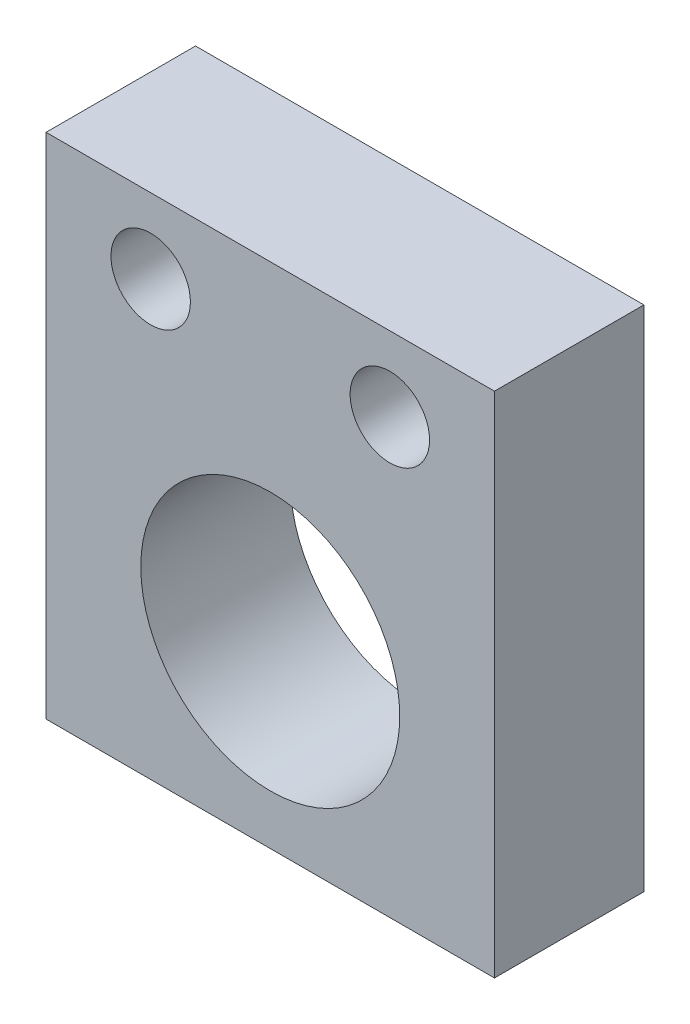
ISO-10303-21;
HEADER;
FILE_DESCRIPTION(('STEP AP214'),'2;1');
FILE_NAME('part.step','',(''),(''),'','','');
FILE_SCHEMA(('AUTOMOTIVE_DESIGN { 1 0 10303 214 1 1 1 1 }'));
ENDSEC;
DATA;
#1=APPLICATION_CONTEXT('core data for automotive mechanical design processes');
#2=APPLICATION_PROTOCOL_DEFINITION('international standard','automotive_design',2000,#1);
#3=PRODUCT_CONTEXT('',#1,'mechanical');
#4=PRODUCT('Part','Part','',(#3));
#5=PRODUCT_RELATED_PRODUCT_CATEGORY('part','',(#4));
#6=PRODUCT_DEFINITION_FORMATION('','',#4);
#7=PRODUCT_DEFINITION_CONTEXT('part definition',#1,'design');
#8=PRODUCT_DEFINITION('design','',#6,#7);
#9=PRODUCT_DEFINITION_SHAPE('','',#8);
#10=(LENGTH_UNIT() NAMED_UNIT(*) SI_UNIT(.MILLI.,.METRE.));
#11=(NAMED_UNIT(*) PLANE_ANGLE_UNIT() SI_UNIT($,.RADIAN.));
#12=(NAMED_UNIT(*) SI_UNIT($,.STERADIAN.) SOLID_ANGLE_UNIT());
#13=UNCERTAINTY_MEASURE_WITH_UNIT(LENGTH_MEASURE(1.E-05),#10,'distance_accuracy_value','');
#14=(GEOMETRIC_REPRESENTATION_CONTEXT(3) GLOBAL_UNCERTAINTY_ASSIGNED_CONTEXT((#13)) GLOBAL_UNIT_ASSIGNED_CONTEXT((#10,
#11,#12)) REPRESENTATION_CONTEXT('',''));
#15=CARTESIAN_POINT('',(0.,0.,0.));
#16=DIRECTION('',(0.,0.,1.));
#17=DIRECTION('',(1.,0.,0.));
#18=AXIS2_PLACEMENT_3D('',#15,#16,#17);
#19=CARTESIAN_POINT('',(0.,0.,-12.7));
#20=DIRECTION('',(-1.,0.,0.));
#21=DIRECTION('',(0.,0.,1.));
#22=AXIS2_PLACEMENT_3D('',#19,#20,#21);
#23=PLANE('',#22);
#24=DIRECTION('',(0.,-1.,0.));
#25=VECTOR('',#24,1.);
#26=CARTESIAN_POINT('',(0.,0.,0.));
#27=LINE('',#26,#25);
#28=CARTESIAN_POINT('',(0.,43.18,0.));
#29=VERTEX_POINT('',#28);
#30=CARTESIAN_POINT('',(0.,0.,0.));
#31=VERTEX_POINT('',#30);
#32=EDGE_CURVE('E113',#29,#31,#27,.T.);
#33=ORIENTED_EDGE('',*,*,#32,.F.);
#34=DIRECTION('',(0.,0.,1.));
#35=VECTOR('',#34,1.);
#36=CARTESIAN_POINT('',(0.,43.18,-12.7));
#37=LINE('',#36,#35);
#38=CARTESIAN_POINT('',(0.,43.18,-12.7));
#39=VERTEX_POINT('',#38);
#40=EDGE_CURVE('E13',#39,#29,#37,.T.);
#41=ORIENTED_EDGE('',*,*,#40,.F.);
#42=DIRECTION('',(0.,-1.,0.));
#43=VECTOR('',#42,1.);
#44=CARTESIAN_POINT('',(0.,0.,-12.7));
#45=LINE('',#44,#43);
#46=CARTESIAN_POINT('',(0.,0.,-12.7));
#47=VERTEX_POINT('',#46);
#48=EDGE_CURVE('E106',#39,#47,#45,.T.);
#49=ORIENTED_EDGE('',*,*,#48,.T.);
#50=DIRECTION('',(0.,0.,1.));
#51=VECTOR('',#50,1.);
#52=CARTESIAN_POINT('',(0.,0.,-12.7));
#53=LINE('',#52,#51);
#54=EDGE_CURVE('E51',#47,#31,#53,.T.);
#55=ORIENTED_EDGE('',*,*,#54,.T.);
#56=EDGE_LOOP('',(#33,#41,#49,#55));
#57=FACE_BOUND('',#56,.T.);
#58=ADVANCED_FACE('F48',(#57),#23,.T.);
#59=CARTESIAN_POINT('',(0.,43.18,-12.7));
#60=DIRECTION('',(0.,1.,0.));
#61=DIRECTION('',(0.,0.,1.));
#62=AXIS2_PLACEMENT_3D('',#59,#60,#61);
#63=PLANE('',#62);
#64=DIRECTION('',(-1.,0.,0.));
#65=VECTOR('',#64,1.);
#66=CARTESIAN_POINT('',(0.,43.18,0.));
#67=LINE('',#66,#65);
#68=CARTESIAN_POINT('',(38.1,43.18,0.));
#69=VERTEX_POINT('',#68);
#70=EDGE_CURVE('E108',#69,#29,#67,.T.);
#71=ORIENTED_EDGE('',*,*,#70,.F.);
#72=DIRECTION('',(0.,0.,1.));
#73=VECTOR('',#72,1.);
#74=CARTESIAN_POINT('',(38.1,43.18,-12.7));
#75=LINE('',#74,#73);
#76=CARTESIAN_POINT('',(38.1,43.18,-12.7));
#77=VERTEX_POINT('',#76);
#78=EDGE_CURVE('E57',#77,#69,#75,.T.);
#79=ORIENTED_EDGE('',*,*,#78,.F.);
#80=DIRECTION('',(-1.,0.,0.));
#81=VECTOR('',#80,1.);
#82=CARTESIAN_POINT('',(0.,43.18,-12.7));
#83=LINE('',#82,#81);
#84=EDGE_CURVE('E103',#77,#39,#83,.T.);
#85=ORIENTED_EDGE('',*,*,#84,.T.);
#86=ORIENTED_EDGE('',*,*,#40,.T.);
#87=EDGE_LOOP('',(#71,#79,#85,#86));
#88=FACE_BOUND('',#87,.T.);
#89=ADVANCED_FACE('F124',(#88),#63,.T.);
#90=CARTESIAN_POINT('',(38.1,0.,-12.7));
#91=DIRECTION('',(1.,0.,0.));
#92=DIRECTION('',(0.,0.,-1.));
#93=AXIS2_PLACEMENT_3D('',#90,#91,#92);
#94=PLANE('',#93);
#95=DIRECTION('',(0.,1.,0.));
#96=VECTOR('',#95,1.);
#97=CARTESIAN_POINT('',(38.1,0.,0.));
#98=LINE('',#97,#96);
#99=CARTESIAN_POINT('',(38.1,0.,0.));
#100=VERTEX_POINT('',#99);
#101=EDGE_CURVE('E98',#100,#69,#98,.T.);
#102=ORIENTED_EDGE('',*,*,#101,.F.);
#103=DIRECTION('',(0.,0.,1.));
#104=VECTOR('',#103,1.);
#105=CARTESIAN_POINT('',(38.1,0.,-12.7));
#106=LINE('',#105,#104);
#107=CARTESIAN_POINT('',(38.1,0.,-12.7));
#108=VERTEX_POINT('',#107);
#109=EDGE_CURVE('E93',#108,#100,#106,.T.);
#110=ORIENTED_EDGE('',*,*,#109,.F.);
#111=DIRECTION('',(0.,1.,0.));
#112=VECTOR('',#111,1.);
#113=CARTESIAN_POINT('',(38.1,0.,-12.7));
#114=LINE('',#113,#112);
#115=EDGE_CURVE('E96',#108,#77,#114,.T.);
#116=ORIENTED_EDGE('',*,*,#115,.T.);
#117=ORIENTED_EDGE('',*,*,#78,.T.);
#118=EDGE_LOOP('',(#102,#110,#116,#117));
#119=FACE_BOUND('',#118,.T.);
#120=ADVANCED_FACE('F95',(#119),#94,.T.);
#121=CARTESIAN_POINT('',(0.,0.,-12.7));
#122=DIRECTION('',(0.,-1.,0.));
#123=DIRECTION('',(0.,0.,-1.));
#124=AXIS2_PLACEMENT_3D('',#121,#122,#123);
#125=PLANE('',#124);
#126=DIRECTION('',(1.,0.,0.));
#127=VECTOR('',#126,1.);
#128=CARTESIAN_POINT('',(0.,0.,0.));
#129=LINE('',#128,#127);
#130=EDGE_CURVE('E116',#31,#100,#129,.T.);
#131=ORIENTED_EDGE('',*,*,#130,.F.);
#132=ORIENTED_EDGE('',*,*,#54,.F.);
#133=DIRECTION('',(1.,0.,0.));
#134=VECTOR('',#133,1.);
#135=CARTESIAN_POINT('',(0.,0.,-12.7));
#136=LINE('',#135,#134);
#137=EDGE_CURVE('E102',#47,#108,#136,.T.);
#138=ORIENTED_EDGE('',*,*,#137,.T.);
#139=ORIENTED_EDGE('',*,*,#109,.T.);
#140=EDGE_LOOP('',(#131,#132,#138,#139));
#141=FACE_BOUND('',#140,.T.);
#142=ADVANCED_FACE('F105',(#141),#125,.T.);
#143=CARTESIAN_POINT('',(0.,0.,-12.7));
#144=DIRECTION('',(0.,0.,-1.));
#145=DIRECTION('',(-1.,0.,0.));
#146=AXIS2_PLACEMENT_3D('',#143,#144,#145);
#147=PLANE('',#146);
#148=CARTESIAN_POINT('',(29.21,36.83,-12.7));
#149=DIRECTION('',(0.,0.,1.));
#150=DIRECTION('',(1.,0.,0.));
#151=AXIS2_PLACEMENT_3D('',#148,#149,#150);
#152=CIRCLE('',#151,3.37350099999999);
#153=CARTESIAN_POINT('',(32.583501,36.83,-12.7));
#154=VERTEX_POINT('',#153);
#155=EDGE_CURVE('E161',#154,#154,#152,.T.);
#156=ORIENTED_EDGE('',*,*,#155,.T.);
#157=EDGE_LOOP('',(#156));
#158=FACE_BOUND('',#157,.T.);
#159=CARTESIAN_POINT('',(8.89,36.83,-12.7));
#160=DIRECTION('',(0.,0.,1.));
#161=DIRECTION('',(1.,0.,0.));
#162=AXIS2_PLACEMENT_3D('',#159,#160,#161);
#163=CIRCLE('',#162,3.373501);
#164=CARTESIAN_POINT('',(12.263501,36.83,-12.7));
#165=VERTEX_POINT('',#164);
#166=EDGE_CURVE('E171',#165,#165,#163,.T.);
#167=ORIENTED_EDGE('',*,*,#166,.T.);
#168=EDGE_LOOP('',(#167));
#169=FACE_BOUND('',#168,.T.);
#170=CARTESIAN_POINT('',(19.05,15.24,-12.7));
#171=DIRECTION('',(0.,0.,1.));
#172=DIRECTION('',(1.,0.,0.));
#173=AXIS2_PLACEMENT_3D('',#170,#171,#172);
#174=CIRCLE('',#173,11.);
#175=CARTESIAN_POINT('',(30.05,15.24,-12.7));
#176=VERTEX_POINT('',#175);
#177=EDGE_CURVE('E117',#176,#176,#174,.T.);
#178=ORIENTED_EDGE('',*,*,#177,.T.);
#179=EDGE_LOOP('',(#178));
#180=FACE_BOUND('',#179,.T.);
#181=ORIENTED_EDGE('',*,*,#48,.F.);
#182=ORIENTED_EDGE('',*,*,#84,.F.);
#183=ORIENTED_EDGE('',*,*,#115,.F.);
#184=ORIENTED_EDGE('',*,*,#137,.F.);
#185=EDGE_LOOP('',(#181,#182,#183,#184));
#186=FACE_BOUND('',#185,.T.);
#187=ADVANCED_FACE('F101',(#158,#169,#180,#186),#147,.T.);
#188=CARTESIAN_POINT('',(0.,0.,0.));
#189=DIRECTION('',(0.,0.,-1.));
#190=DIRECTION('',(-1.,0.,0.));
#191=AXIS2_PLACEMENT_3D('',#188,#189,#190);
#192=PLANE('',#191);
#193=CARTESIAN_POINT('',(29.21,36.83,0.));
#194=DIRECTION('',(0.,0.,1.));
#195=DIRECTION('',(1.,0.,0.));
#196=AXIS2_PLACEMENT_3D('',#193,#194,#195);
#197=CIRCLE('',#196,3.373501);
#198=CARTESIAN_POINT('',(32.583501,36.83,0.));
#199=VERTEX_POINT('',#198);
#200=EDGE_CURVE('E164',#199,#199,#197,.T.);
#201=ORIENTED_EDGE('',*,*,#200,.F.);
#202=EDGE_LOOP('',(#201));
#203=FACE_BOUND('',#202,.T.);
#204=CARTESIAN_POINT('',(8.89,36.83,0.));
#205=DIRECTION('',(0.,0.,1.));
#206=DIRECTION('',(1.,0.,0.));
#207=AXIS2_PLACEMENT_3D('',#204,#205,#206);
#208=CIRCLE('',#207,3.373501);
#209=CARTESIAN_POINT('',(12.263501,36.83,0.));
#210=VERTEX_POINT('',#209);
#211=EDGE_CURVE('E166',#210,#210,#208,.T.);
#212=ORIENTED_EDGE('',*,*,#211,.F.);
#213=EDGE_LOOP('',(#212));
#214=FACE_BOUND('',#213,.T.);
#215=CARTESIAN_POINT('',(19.05,15.24,0.));
#216=DIRECTION('',(0.,0.,1.));
#217=DIRECTION('',(1.,0.,0.));
#218=AXIS2_PLACEMENT_3D('',#215,#216,#217);
#219=CIRCLE('',#218,11.);
#220=CARTESIAN_POINT('',(30.05,15.24,0.));
#221=VERTEX_POINT('',#220);
#222=EDGE_CURVE('E174',#221,#221,#219,.T.);
#223=ORIENTED_EDGE('',*,*,#222,.F.);
#224=EDGE_LOOP('',(#223));
#225=FACE_BOUND('',#224,.T.);
#226=ORIENTED_EDGE('',*,*,#32,.T.);
#227=ORIENTED_EDGE('',*,*,#130,.T.);
#228=ORIENTED_EDGE('',*,*,#101,.T.);
#229=ORIENTED_EDGE('',*,*,#70,.T.);
#230=EDGE_LOOP('',(#226,#227,#228,#229));
#231=FACE_BOUND('',#230,.T.);
#232=ADVANCED_FACE('F123',(#203,#214,#225,#231),#192,.F.);
#233=CARTESIAN_POINT('',(19.05,15.24,-12.7));
#234=DIRECTION('',(0.,0.,1.));
#235=DIRECTION('',(1.,0.,0.));
#236=AXIS2_PLACEMENT_3D('',#233,#234,#235);
#237=CYLINDRICAL_SURFACE('',#236,11.);
#238=ORIENTED_EDGE('',*,*,#177,.F.);
#239=EDGE_LOOP('',(#238));
#240=FACE_BOUND('',#239,.T.);
#241=ORIENTED_EDGE('',*,*,#222,.T.);
#242=EDGE_LOOP('',(#241));
#243=FACE_BOUND('',#242,.T.);
#244=ADVANCED_FACE('F142',(#240,#243),#237,.F.);
#245=CARTESIAN_POINT('',(8.89,36.83,0.));
#246=DIRECTION('',(0.,0.,1.));
#247=DIRECTION('',(1.,0.,0.));
#248=AXIS2_PLACEMENT_3D('',#245,#246,#247);
#249=CYLINDRICAL_SURFACE('',#248,3.373501);
#250=ORIENTED_EDGE('',*,*,#166,.F.);
#251=EDGE_LOOP('',(#250));
#252=FACE_BOUND('',#251,.T.);
#253=ORIENTED_EDGE('',*,*,#211,.T.);
#254=EDGE_LOOP('',(#253));
#255=FACE_BOUND('',#254,.T.);
#256=ADVANCED_FACE('F149',(#252,#255),#249,.F.);
#257=CARTESIAN_POINT('',(29.21,36.83,0.));
#258=DIRECTION('',(0.,0.,1.));
#259=DIRECTION('',(1.,0.,0.));
#260=AXIS2_PLACEMENT_3D('',#257,#258,#259);
#261=CYLINDRICAL_SURFACE('',#260,3.373501);
#262=ORIENTED_EDGE('',*,*,#155,.F.);
#263=EDGE_LOOP('',(#262));
#264=FACE_BOUND('',#263,.T.);
#265=ORIENTED_EDGE('',*,*,#200,.T.);
#266=EDGE_LOOP('',(#265));
#267=FACE_BOUND('',#266,.T.);
#268=ADVANCED_FACE('F153',(#264,#267),#261,.F.);
#269=CLOSED_SHELL('',(#58,#89,#120,#142,#187,#232,#244,#256,#268));
#270=MANIFOLD_SOLID_BREP('B2',#269);
#271=ADVANCED_BREP_SHAPE_REPRESENTATION('',(#18,#270),#14);
#272=SHAPE_DEFINITION_REPRESENTATION(#9,#271);
ENDSEC;
END-ISO-10303-21;
